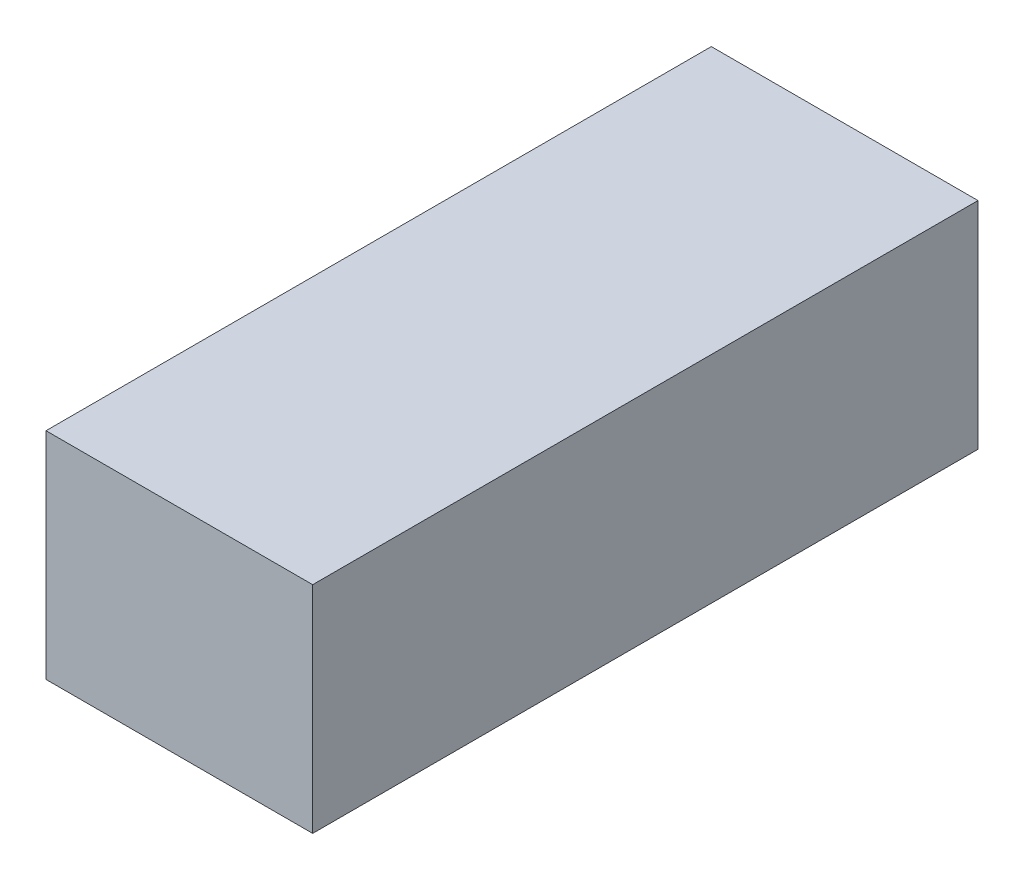
ISO-10303-21;
HEADER;
FILE_DESCRIPTION(('STEP AP214'),'2;1');
FILE_NAME('part.step','',(''),(''),'','','');
FILE_SCHEMA(('AUTOMOTIVE_DESIGN { 1 0 10303 214 1 1 1 1 }'));
ENDSEC;
DATA;
#1=APPLICATION_CONTEXT('core data for automotive mechanical design processes');
#2=APPLICATION_PROTOCOL_DEFINITION('international standard','automotive_design',2000,#1);
#3=PRODUCT_CONTEXT('',#1,'mechanical');
#4=PRODUCT('Part','Part','',(#3));
#5=PRODUCT_RELATED_PRODUCT_CATEGORY('part','',(#4));
#6=PRODUCT_DEFINITION_FORMATION('','',#4);
#7=PRODUCT_DEFINITION_CONTEXT('part definition',#1,'design');
#8=PRODUCT_DEFINITION('design','',#6,#7);
#9=PRODUCT_DEFINITION_SHAPE('','',#8);
#10=(LENGTH_UNIT() NAMED_UNIT(*) SI_UNIT(.MILLI.,.METRE.));
#11=(NAMED_UNIT(*) PLANE_ANGLE_UNIT() SI_UNIT($,.RADIAN.));
#12=(NAMED_UNIT(*) SI_UNIT($,.STERADIAN.) SOLID_ANGLE_UNIT());
#13=UNCERTAINTY_MEASURE_WITH_UNIT(LENGTH_MEASURE(1.E-05),#10,'distance_accuracy_value','');
#14=(GEOMETRIC_REPRESENTATION_CONTEXT(3) GLOBAL_UNCERTAINTY_ASSIGNED_CONTEXT((#13)) GLOBAL_UNIT_ASSIGNED_CONTEXT((#10,
#11,#12)) REPRESENTATION_CONTEXT('',''));
#15=CARTESIAN_POINT('',(0.,0.,0.));
#16=DIRECTION('',(0.,0.,1.));
#17=DIRECTION('',(1.,0.,0.));
#18=AXIS2_PLACEMENT_3D('',#15,#16,#17);
#19=CARTESIAN_POINT('',(13.79,22.28,-34.405));
#20=DIRECTION('',(-1.,0.,0.));
#21=DIRECTION('',(0.,0.,1.));
#22=AXIS2_PLACEMENT_3D('',#19,#20,#21);
#23=PLANE('',#22);
#24=DIRECTION('',(0.,0.,-1.));
#25=VECTOR('',#24,1.);
#26=CARTESIAN_POINT('',(13.79,0.,-34.405));
#27=LINE('',#26,#25);
#28=CARTESIAN_POINT('',(13.79,0.,34.405));
#29=VERTEX_POINT('',#28);
#30=CARTESIAN_POINT('',(13.79,0.,-34.405));
#31=VERTEX_POINT('',#30);
#32=EDGE_CURVE('E115',#29,#31,#27,.T.);
#33=ORIENTED_EDGE('',*,*,#32,.T.);
#34=DIRECTION('',(0.,-1.,0.));
#35=VECTOR('',#34,1.);
#36=CARTESIAN_POINT('',(13.79,22.28,-34.405));
#37=LINE('',#36,#35);
#38=CARTESIAN_POINT('',(13.79,22.28,-34.405));
#39=VERTEX_POINT('',#38);
#40=EDGE_CURVE('E11',#39,#31,#37,.T.);
#41=ORIENTED_EDGE('',*,*,#40,.F.);
#42=DIRECTION('',(0.,0.,-1.));
#43=VECTOR('',#42,1.);
#44=CARTESIAN_POINT('',(13.79,22.28,-34.405));
#45=LINE('',#44,#43);
#46=CARTESIAN_POINT('',(13.79,22.28,34.405));
#47=VERTEX_POINT('',#46);
#48=EDGE_CURVE('E99',#47,#39,#45,.T.);
#49=ORIENTED_EDGE('',*,*,#48,.F.);
#50=DIRECTION('',(0.,-1.,0.));
#51=VECTOR('',#50,1.);
#52=CARTESIAN_POINT('',(13.79,22.28,34.405));
#53=LINE('',#52,#51);
#54=EDGE_CURVE('E111',#47,#29,#53,.T.);
#55=ORIENTED_EDGE('',*,*,#54,.T.);
#56=EDGE_LOOP('',(#33,#41,#49,#55));
#57=FACE_BOUND('',#56,.T.);
#58=ADVANCED_FACE('F47',(#57),#23,.F.);
#59=CARTESIAN_POINT('',(-13.79,22.28,-34.405));
#60=DIRECTION('',(0.,0.,1.));
#61=DIRECTION('',(1.,0.,0.));
#62=AXIS2_PLACEMENT_3D('',#59,#60,#61);
#63=PLANE('',#62);
#64=DIRECTION('',(-1.,0.,0.));
#65=VECTOR('',#64,1.);
#66=CARTESIAN_POINT('',(-13.79,0.,-34.405));
#67=LINE('',#66,#65);
#68=CARTESIAN_POINT('',(-13.79,0.,-34.405));
#69=VERTEX_POINT('',#68);
#70=EDGE_CURVE('E104',#31,#69,#67,.T.);
#71=ORIENTED_EDGE('',*,*,#70,.T.);
#72=DIRECTION('',(0.,-1.,0.));
#73=VECTOR('',#72,1.);
#74=CARTESIAN_POINT('',(-13.79,22.28,-34.405));
#75=LINE('',#74,#73);
#76=CARTESIAN_POINT('',(-13.79,22.28,-34.405));
#77=VERTEX_POINT('',#76);
#78=EDGE_CURVE('E56',#77,#69,#75,.T.);
#79=ORIENTED_EDGE('',*,*,#78,.F.);
#80=DIRECTION('',(-1.,0.,0.));
#81=VECTOR('',#80,1.);
#82=CARTESIAN_POINT('',(-13.79,22.28,-34.405));
#83=LINE('',#82,#81);
#84=EDGE_CURVE('E94',#39,#77,#83,.T.);
#85=ORIENTED_EDGE('',*,*,#84,.F.);
#86=ORIENTED_EDGE('',*,*,#40,.T.);
#87=EDGE_LOOP('',(#71,#79,#85,#86));
#88=FACE_BOUND('',#87,.T.);
#89=ADVANCED_FACE('F103',(#88),#63,.F.);
#90=CARTESIAN_POINT('',(-13.79,22.28,-34.405));
#91=DIRECTION('',(1.,0.,0.));
#92=DIRECTION('',(0.,0.,-1.));
#93=AXIS2_PLACEMENT_3D('',#90,#91,#92);
#94=PLANE('',#93);
#95=DIRECTION('',(0.,0.,1.));
#96=VECTOR('',#95,1.);
#97=CARTESIAN_POINT('',(-13.79,0.,-34.405));
#98=LINE('',#97,#96);
#99=CARTESIAN_POINT('',(-13.79,0.,34.405));
#100=VERTEX_POINT('',#99);
#101=EDGE_CURVE('E81',#69,#100,#98,.T.);
#102=ORIENTED_EDGE('',*,*,#101,.T.);
#103=DIRECTION('',(0.,-1.,0.));
#104=VECTOR('',#103,1.);
#105=CARTESIAN_POINT('',(-13.79,22.28,34.405));
#106=LINE('',#105,#104);
#107=CARTESIAN_POINT('',(-13.79,22.28,34.405));
#108=VERTEX_POINT('',#107);
#109=EDGE_CURVE('E106',#108,#100,#106,.T.);
#110=ORIENTED_EDGE('',*,*,#109,.F.);
#111=DIRECTION('',(0.,0.,1.));
#112=VECTOR('',#111,1.);
#113=CARTESIAN_POINT('',(-13.79,22.28,-34.405));
#114=LINE('',#113,#112);
#115=EDGE_CURVE('E97',#77,#108,#114,.T.);
#116=ORIENTED_EDGE('',*,*,#115,.F.);
#117=ORIENTED_EDGE('',*,*,#78,.T.);
#118=EDGE_LOOP('',(#102,#110,#116,#117));
#119=FACE_BOUND('',#118,.T.);
#120=ADVANCED_FACE('F107',(#119),#94,.F.);
#121=CARTESIAN_POINT('',(-13.79,22.28,34.405));
#122=DIRECTION('',(0.,0.,-1.));
#123=DIRECTION('',(-1.,0.,0.));
#124=AXIS2_PLACEMENT_3D('',#121,#122,#123);
#125=PLANE('',#124);
#126=DIRECTION('',(1.,0.,0.));
#127=VECTOR('',#126,1.);
#128=CARTESIAN_POINT('',(-13.79,0.,34.405));
#129=LINE('',#128,#127);
#130=EDGE_CURVE('E87',#100,#29,#129,.T.);
#131=ORIENTED_EDGE('',*,*,#130,.T.);
#132=ORIENTED_EDGE('',*,*,#54,.F.);
#133=DIRECTION('',(1.,0.,0.));
#134=VECTOR('',#133,1.);
#135=CARTESIAN_POINT('',(-13.79,22.28,34.405));
#136=LINE('',#135,#134);
#137=EDGE_CURVE('E64',#108,#47,#136,.T.);
#138=ORIENTED_EDGE('',*,*,#137,.F.);
#139=ORIENTED_EDGE('',*,*,#109,.T.);
#140=EDGE_LOOP('',(#131,#132,#138,#139));
#141=FACE_BOUND('',#140,.T.);
#142=ADVANCED_FACE('F128',(#141),#125,.F.);
#143=CARTESIAN_POINT('',(0.,22.28,0.));
#144=DIRECTION('',(0.,1.,0.));
#145=DIRECTION('',(0.,0.,1.));
#146=AXIS2_PLACEMENT_3D('',#143,#144,#145);
#147=PLANE('',#146);
#148=ORIENTED_EDGE('',*,*,#48,.T.);
#149=ORIENTED_EDGE('',*,*,#84,.T.);
#150=ORIENTED_EDGE('',*,*,#115,.T.);
#151=ORIENTED_EDGE('',*,*,#137,.T.);
#152=EDGE_LOOP('',(#148,#149,#150,#151));
#153=FACE_BOUND('',#152,.T.);
#154=ADVANCED_FACE('F95',(#153),#147,.T.);
#155=CARTESIAN_POINT('',(0.,0.,0.));
#156=DIRECTION('',(0.,1.,0.));
#157=DIRECTION('',(0.,0.,1.));
#158=AXIS2_PLACEMENT_3D('',#155,#156,#157);
#159=PLANE('',#158);
#160=ORIENTED_EDGE('',*,*,#32,.F.);
#161=ORIENTED_EDGE('',*,*,#130,.F.);
#162=ORIENTED_EDGE('',*,*,#101,.F.);
#163=ORIENTED_EDGE('',*,*,#70,.F.);
#164=EDGE_LOOP('',(#160,#161,#162,#163));
#165=FACE_BOUND('',#164,.T.);
#166=ADVANCED_FACE('F131',(#165),#159,.F.);
#167=CLOSED_SHELL('',(#58,#89,#120,#142,#154,#166));
#168=MANIFOLD_SOLID_BREP('B2',#167);
#169=ADVANCED_BREP_SHAPE_REPRESENTATION('',(#18,#168),#14);
#170=SHAPE_DEFINITION_REPRESENTATION(#9,#169);
ENDSEC;
END-ISO-10303-21;
